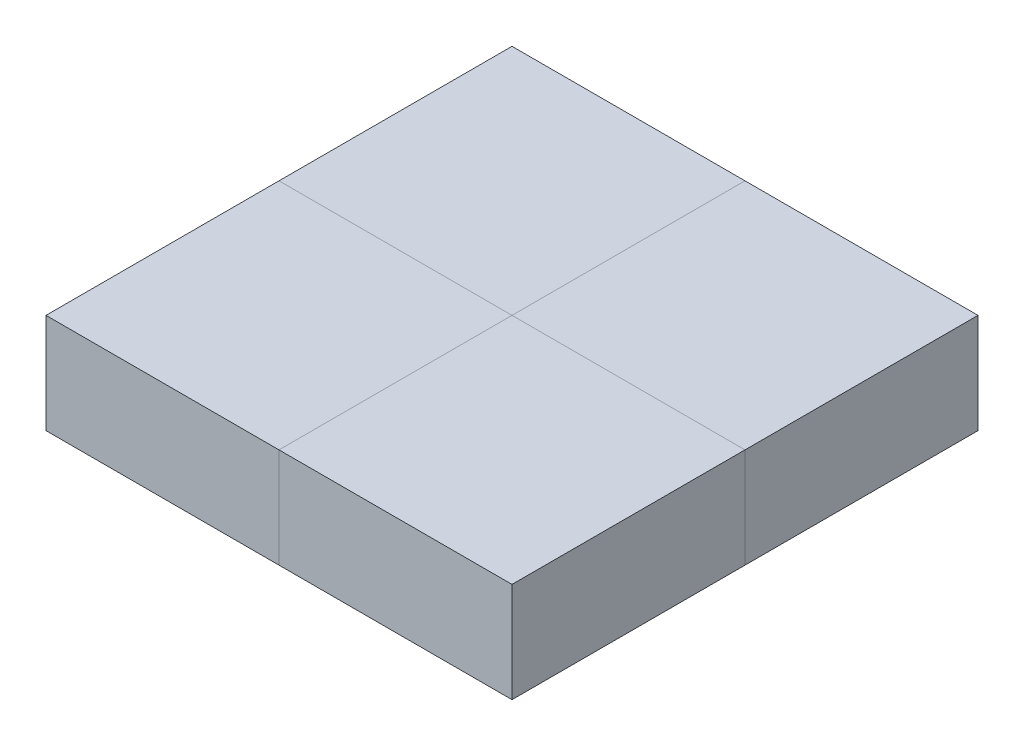
ISO-10303-21;
HEADER;
FILE_DESCRIPTION(('STEP AP214'),'2;1');
FILE_NAME('part.step','',(''),(''),'','','');
FILE_SCHEMA(('AUTOMOTIVE_DESIGN { 1 0 10303 214 1 1 1 1 }'));
ENDSEC;
DATA;
#1=APPLICATION_CONTEXT('core data for automotive mechanical design processes');
#2=APPLICATION_PROTOCOL_DEFINITION('international standard','automotive_design',2000,#1);
#3=PRODUCT_CONTEXT('',#1,'mechanical');
#4=PRODUCT('Part','Part','',(#3));
#5=PRODUCT_RELATED_PRODUCT_CATEGORY('part','',(#4));
#6=PRODUCT_DEFINITION_FORMATION('','',#4);
#7=PRODUCT_DEFINITION_CONTEXT('part definition',#1,'design');
#8=PRODUCT_DEFINITION('design','',#6,#7);
#9=PRODUCT_DEFINITION_SHAPE('','',#8);
#10=(LENGTH_UNIT() NAMED_UNIT(*) SI_UNIT(.MILLI.,.METRE.));
#11=(NAMED_UNIT(*) PLANE_ANGLE_UNIT() SI_UNIT($,.RADIAN.));
#12=(NAMED_UNIT(*) SI_UNIT($,.STERADIAN.) SOLID_ANGLE_UNIT());
#13=UNCERTAINTY_MEASURE_WITH_UNIT(LENGTH_MEASURE(1.E-05),#10,'distance_accuracy_value','');
#14=(GEOMETRIC_REPRESENTATION_CONTEXT(3) GLOBAL_UNCERTAINTY_ASSIGNED_CONTEXT((#13)) GLOBAL_UNIT_ASSIGNED_CONTEXT((#10,
#11,#12)) REPRESENTATION_CONTEXT('',''));
#15=CARTESIAN_POINT('',(0.,0.,0.));
#16=DIRECTION('',(0.,0.,1.));
#17=DIRECTION('',(1.,0.,0.));
#18=AXIS2_PLACEMENT_3D('',#15,#16,#17);
#19=CARTESIAN_POINT('',(22.225,19.05,22.225));
#20=DIRECTION('',(1.,0.,0.));
#21=DIRECTION('',(0.,0.,-1.));
#22=AXIS2_PLACEMENT_3D('',#19,#20,#21);
#23=PLANE('',#22);
#24=DIRECTION('',(0.,0.,1.));
#25=VECTOR('',#24,1.);
#26=CARTESIAN_POINT('',(22.225,0.,22.225));
#27=LINE('',#26,#25);
#28=CARTESIAN_POINT('',(22.225,0.,22.225));
#29=VERTEX_POINT('',#28);
#30=CARTESIAN_POINT('',(22.225,0.,66.675));
#31=VERTEX_POINT('',#30);
#32=EDGE_CURVE('E115',#29,#31,#27,.T.);
#33=ORIENTED_EDGE('',*,*,#32,.T.);
#34=DIRECTION('',(0.,-1.,0.));
#35=VECTOR('',#34,1.);
#36=CARTESIAN_POINT('',(22.225,19.05,66.675));
#37=LINE('',#36,#35);
#38=CARTESIAN_POINT('',(22.225,19.05,66.675));
#39=VERTEX_POINT('',#38);
#40=EDGE_CURVE('E12',#39,#31,#37,.T.);
#41=ORIENTED_EDGE('',*,*,#40,.F.);
#42=DIRECTION('',(0.,0.,1.));
#43=VECTOR('',#42,1.);
#44=CARTESIAN_POINT('',(22.225,19.05,22.225));
#45=LINE('',#44,#43);
#46=CARTESIAN_POINT('',(22.225,19.05,22.225));
#47=VERTEX_POINT('',#46);
#48=EDGE_CURVE('E97',#47,#39,#45,.T.);
#49=ORIENTED_EDGE('',*,*,#48,.F.);
#50=DIRECTION('',(0.,-1.,0.));
#51=VECTOR('',#50,1.);
#52=CARTESIAN_POINT('',(22.225,19.05,22.225));
#53=LINE('',#52,#51);
#54=EDGE_CURVE('E111',#47,#29,#53,.T.);
#55=ORIENTED_EDGE('',*,*,#54,.T.);
#56=EDGE_LOOP('',(#33,#41,#49,#55));
#57=FACE_BOUND('',#56,.T.);
#58=ADVANCED_FACE('F45',(#57),#23,.F.);
#59=CARTESIAN_POINT('',(22.225,19.05,66.675));
#60=DIRECTION('',(0.,0.,-1.));
#61=DIRECTION('',(-1.,0.,0.));
#62=AXIS2_PLACEMENT_3D('',#59,#60,#61);
#63=PLANE('',#62);
#64=DIRECTION('',(1.,0.,0.));
#65=VECTOR('',#64,1.);
#66=CARTESIAN_POINT('',(22.225,0.,66.675));
#67=LINE('',#66,#65);
#68=CARTESIAN_POINT('',(66.675,0.,66.675));
#69=VERTEX_POINT('',#68);
#70=EDGE_CURVE('E102',#31,#69,#67,.T.);
#71=ORIENTED_EDGE('',*,*,#70,.T.);
#72=DIRECTION('',(0.,-1.,0.));
#73=VECTOR('',#72,1.);
#74=CARTESIAN_POINT('',(66.675,19.05,66.675));
#75=LINE('',#74,#73);
#76=CARTESIAN_POINT('',(66.675,19.05,66.675));
#77=VERTEX_POINT('',#76);
#78=EDGE_CURVE('E54',#77,#69,#75,.T.);
#79=ORIENTED_EDGE('',*,*,#78,.F.);
#80=DIRECTION('',(1.,0.,0.));
#81=VECTOR('',#80,1.);
#82=CARTESIAN_POINT('',(22.225,19.05,66.675));
#83=LINE('',#82,#81);
#84=EDGE_CURVE('E92',#39,#77,#83,.T.);
#85=ORIENTED_EDGE('',*,*,#84,.F.);
#86=ORIENTED_EDGE('',*,*,#40,.T.);
#87=EDGE_LOOP('',(#71,#79,#85,#86));
#88=FACE_BOUND('',#87,.T.);
#89=ADVANCED_FACE('F101',(#88),#63,.F.);
#90=CARTESIAN_POINT('',(66.675,19.05,22.225));
#91=DIRECTION('',(-1.,0.,0.));
#92=DIRECTION('',(0.,0.,1.));
#93=AXIS2_PLACEMENT_3D('',#90,#91,#92);
#94=PLANE('',#93);
#95=DIRECTION('',(0.,0.,-1.));
#96=VECTOR('',#95,1.);
#97=CARTESIAN_POINT('',(66.675,0.,22.225));
#98=LINE('',#97,#96);
#99=CARTESIAN_POINT('',(66.675,0.,22.225));
#100=VERTEX_POINT('',#99);
#101=EDGE_CURVE('E79',#69,#100,#98,.T.);
#102=ORIENTED_EDGE('',*,*,#101,.T.);
#103=DIRECTION('',(0.,-1.,0.));
#104=VECTOR('',#103,1.);
#105=CARTESIAN_POINT('',(66.675,19.05,22.225));
#106=LINE('',#105,#104);
#107=CARTESIAN_POINT('',(66.675,19.05,22.225));
#108=VERTEX_POINT('',#107);
#109=EDGE_CURVE('E104',#108,#100,#106,.T.);
#110=ORIENTED_EDGE('',*,*,#109,.F.);
#111=DIRECTION('',(0.,0.,-1.));
#112=VECTOR('',#111,1.);
#113=CARTESIAN_POINT('',(66.675,19.05,22.225));
#114=LINE('',#113,#112);
#115=EDGE_CURVE('E95',#77,#108,#114,.T.);
#116=ORIENTED_EDGE('',*,*,#115,.F.);
#117=ORIENTED_EDGE('',*,*,#78,.T.);
#118=EDGE_LOOP('',(#102,#110,#116,#117));
#119=FACE_BOUND('',#118,.T.);
#120=ADVANCED_FACE('F105',(#119),#94,.F.);
#121=CARTESIAN_POINT('',(22.225,19.05,22.225));
#122=DIRECTION('',(0.,0.,1.));
#123=DIRECTION('',(1.,0.,0.));
#124=AXIS2_PLACEMENT_3D('',#121,#122,#123);
#125=PLANE('',#124);
#126=DIRECTION('',(-1.,0.,0.));
#127=VECTOR('',#126,1.);
#128=CARTESIAN_POINT('',(22.225,0.,22.225));
#129=LINE('',#128,#127);
#130=EDGE_CURVE('E85',#100,#29,#129,.T.);
#131=ORIENTED_EDGE('',*,*,#130,.T.);
#132=ORIENTED_EDGE('',*,*,#54,.F.);
#133=DIRECTION('',(-1.,0.,0.));
#134=VECTOR('',#133,1.);
#135=CARTESIAN_POINT('',(22.225,19.05,22.225));
#136=LINE('',#135,#134);
#137=EDGE_CURVE('E62',#108,#47,#136,.T.);
#138=ORIENTED_EDGE('',*,*,#137,.F.);
#139=ORIENTED_EDGE('',*,*,#109,.T.);
#140=EDGE_LOOP('',(#131,#132,#138,#139));
#141=FACE_BOUND('',#140,.T.);
#142=ADVANCED_FACE('F130',(#141),#125,.F.);
#143=CARTESIAN_POINT('',(0.,19.05,0.));
#144=DIRECTION('',(0.,1.,0.));
#145=DIRECTION('',(0.,0.,1.));
#146=AXIS2_PLACEMENT_3D('',#143,#144,#145);
#147=PLANE('',#146);
#148=ORIENTED_EDGE('',*,*,#48,.T.);
#149=ORIENTED_EDGE('',*,*,#84,.T.);
#150=ORIENTED_EDGE('',*,*,#115,.T.);
#151=ORIENTED_EDGE('',*,*,#137,.T.);
#152=EDGE_LOOP('',(#148,#149,#150,#151));
#153=FACE_BOUND('',#152,.T.);
#154=ADVANCED_FACE('F93',(#153),#147,.T.);
#155=CARTESIAN_POINT('',(0.,0.,0.));
#156=DIRECTION('',(0.,1.,0.));
#157=DIRECTION('',(0.,0.,1.));
#158=AXIS2_PLACEMENT_3D('',#155,#156,#157);
#159=PLANE('',#158);
#160=ORIENTED_EDGE('',*,*,#32,.F.);
#161=ORIENTED_EDGE('',*,*,#130,.F.);
#162=ORIENTED_EDGE('',*,*,#101,.F.);
#163=ORIENTED_EDGE('',*,*,#70,.F.);
#164=EDGE_LOOP('',(#160,#161,#162,#163));
#165=FACE_BOUND('',#164,.T.);
#166=ADVANCED_FACE('F133',(#165),#159,.F.);
#167=CLOSED_SHELL('',(#58,#89,#120,#142,#154,#166));
#168=MANIFOLD_SOLID_BREP('B2',#167);
#169=CARTESIAN_POINT('',(-22.225,19.05,22.225));
#170=DIRECTION('',(1.,0.,0.));
#171=DIRECTION('',(0.,0.,-1.));
#172=AXIS2_PLACEMENT_3D('',#169,#170,#171);
#173=PLANE('',#172);
#174=DIRECTION('',(0.,0.,1.));
#175=VECTOR('',#174,1.);
#176=CARTESIAN_POINT('',(-22.225,0.,22.225));
#177=LINE('',#176,#175);
#178=CARTESIAN_POINT('',(-22.225,0.,22.225));
#179=VERTEX_POINT('',#178);
#180=CARTESIAN_POINT('',(-22.225,0.,66.675));
#181=VERTEX_POINT('',#180);
#182=EDGE_CURVE('E283',#179,#181,#177,.T.);
#183=ORIENTED_EDGE('',*,*,#182,.T.);
#184=DIRECTION('',(0.,-1.,0.));
#185=VECTOR('',#184,1.);
#186=CARTESIAN_POINT('',(-22.225,19.05,66.675));
#187=LINE('',#186,#185);
#188=CARTESIAN_POINT('',(-22.225,19.05,66.675));
#189=VERTEX_POINT('',#188);
#190=EDGE_CURVE('E43',#189,#181,#187,.T.);
#191=ORIENTED_EDGE('',*,*,#190,.F.);
#192=DIRECTION('',(0.,0.,1.));
#193=VECTOR('',#192,1.);
#194=CARTESIAN_POINT('',(-22.225,19.05,22.225));
#195=LINE('',#194,#193);
#196=CARTESIAN_POINT('',(-22.225,19.05,22.225));
#197=VERTEX_POINT('',#196);
#198=EDGE_CURVE('E264',#197,#189,#195,.T.);
#199=ORIENTED_EDGE('',*,*,#198,.F.);
#200=DIRECTION('',(0.,-1.,0.));
#201=VECTOR('',#200,1.);
#202=CARTESIAN_POINT('',(-22.225,19.05,22.225));
#203=LINE('',#202,#201);
#204=EDGE_CURVE('E279',#197,#179,#203,.T.);
#205=ORIENTED_EDGE('',*,*,#204,.T.);
#206=EDGE_LOOP('',(#183,#191,#199,#205));
#207=FACE_BOUND('',#206,.T.);
#208=ADVANCED_FACE('F212',(#207),#173,.F.);
#209=CARTESIAN_POINT('',(-22.225,19.05,66.675));
#210=DIRECTION('',(0.,0.,-1.));
#211=DIRECTION('',(-1.,0.,0.));
#212=AXIS2_PLACEMENT_3D('',#209,#210,#211);
#213=PLANE('',#212);
#214=DIRECTION('',(1.,0.,0.));
#215=VECTOR('',#214,1.);
#216=CARTESIAN_POINT('',(-22.225,0.,66.675));
#217=LINE('',#216,#215);
#218=CARTESIAN_POINT('',(22.225,0.,66.675));
#219=VERTEX_POINT('',#218);
#220=EDGE_CURVE('E269',#181,#219,#217,.T.);
#221=ORIENTED_EDGE('',*,*,#220,.T.);
#222=DIRECTION('',(0.,-1.,0.));
#223=VECTOR('',#222,1.);
#224=CARTESIAN_POINT('',(22.225,19.05,66.675));
#225=LINE('',#224,#223);
#226=CARTESIAN_POINT('',(22.225,19.05,66.675));
#227=VERTEX_POINT('',#226);
#228=EDGE_CURVE('E221',#227,#219,#225,.T.);
#229=ORIENTED_EDGE('',*,*,#228,.F.);
#230=DIRECTION('',(1.,0.,0.));
#231=VECTOR('',#230,1.);
#232=CARTESIAN_POINT('',(-22.225,19.05,66.675));
#233=LINE('',#232,#231);
#234=EDGE_CURVE('E259',#189,#227,#233,.T.);
#235=ORIENTED_EDGE('',*,*,#234,.F.);
#236=ORIENTED_EDGE('',*,*,#190,.T.);
#237=EDGE_LOOP('',(#221,#229,#235,#236));
#238=FACE_BOUND('',#237,.T.);
#239=ADVANCED_FACE('F268',(#238),#213,.F.);
#240=CARTESIAN_POINT('',(22.225,19.05,22.225));
#241=DIRECTION('',(-1.,0.,0.));
#242=DIRECTION('',(0.,0.,1.));
#243=AXIS2_PLACEMENT_3D('',#240,#241,#242);
#244=PLANE('',#243);
#245=DIRECTION('',(0.,0.,-1.));
#246=VECTOR('',#245,1.);
#247=CARTESIAN_POINT('',(22.225,0.,22.225));
#248=LINE('',#247,#246);
#249=CARTESIAN_POINT('',(22.225,0.,22.225));
#250=VERTEX_POINT('',#249);
#251=EDGE_CURVE('E246',#219,#250,#248,.T.);
#252=ORIENTED_EDGE('',*,*,#251,.T.);
#253=DIRECTION('',(0.,-1.,0.));
#254=VECTOR('',#253,1.);
#255=CARTESIAN_POINT('',(22.225,19.05,22.225));
#256=LINE('',#255,#254);
#257=CARTESIAN_POINT('',(22.225,19.05,22.225));
#258=VERTEX_POINT('',#257);
#259=EDGE_CURVE('E271',#258,#250,#256,.T.);
#260=ORIENTED_EDGE('',*,*,#259,.F.);
#261=DIRECTION('',(0.,0.,-1.));
#262=VECTOR('',#261,1.);
#263=CARTESIAN_POINT('',(22.225,19.05,22.225));
#264=LINE('',#263,#262);
#265=EDGE_CURVE('E262',#227,#258,#264,.T.);
#266=ORIENTED_EDGE('',*,*,#265,.F.);
#267=ORIENTED_EDGE('',*,*,#228,.T.);
#268=EDGE_LOOP('',(#252,#260,#266,#267));
#269=FACE_BOUND('',#268,.T.);
#270=ADVANCED_FACE('F272',(#269),#244,.F.);
#271=CARTESIAN_POINT('',(-22.225,19.05,22.225));
#272=DIRECTION('',(0.,0.,1.));
#273=DIRECTION('',(1.,0.,0.));
#274=AXIS2_PLACEMENT_3D('',#271,#272,#273);
#275=PLANE('',#274);
#276=DIRECTION('',(-1.,0.,0.));
#277=VECTOR('',#276,1.);
#278=CARTESIAN_POINT('',(-22.225,0.,22.225));
#279=LINE('',#278,#277);
#280=EDGE_CURVE('E252',#250,#179,#279,.T.);
#281=ORIENTED_EDGE('',*,*,#280,.T.);
#282=ORIENTED_EDGE('',*,*,#204,.F.);
#283=DIRECTION('',(-1.,0.,0.));
#284=VECTOR('',#283,1.);
#285=CARTESIAN_POINT('',(-22.225,19.05,22.225));
#286=LINE('',#285,#284);
#287=EDGE_CURVE('E229',#258,#197,#286,.T.);
#288=ORIENTED_EDGE('',*,*,#287,.F.);
#289=ORIENTED_EDGE('',*,*,#259,.T.);
#290=EDGE_LOOP('',(#281,#282,#288,#289));
#291=FACE_BOUND('',#290,.T.);
#292=ADVANCED_FACE('F296',(#291),#275,.F.);
#293=CARTESIAN_POINT('',(0.,19.05,0.));
#294=DIRECTION('',(0.,1.,0.));
#295=DIRECTION('',(0.,0.,1.));
#296=AXIS2_PLACEMENT_3D('',#293,#294,#295);
#297=PLANE('',#296);
#298=ORIENTED_EDGE('',*,*,#198,.T.);
#299=ORIENTED_EDGE('',*,*,#234,.T.);
#300=ORIENTED_EDGE('',*,*,#265,.T.);
#301=ORIENTED_EDGE('',*,*,#287,.T.);
#302=EDGE_LOOP('',(#298,#299,#300,#301));
#303=FACE_BOUND('',#302,.T.);
#304=ADVANCED_FACE('F260',(#303),#297,.T.);
#305=CARTESIAN_POINT('',(0.,0.,0.));
#306=DIRECTION('',(0.,1.,0.));
#307=DIRECTION('',(0.,0.,1.));
#308=AXIS2_PLACEMENT_3D('',#305,#306,#307);
#309=PLANE('',#308);
#310=ORIENTED_EDGE('',*,*,#182,.F.);
#311=ORIENTED_EDGE('',*,*,#280,.F.);
#312=ORIENTED_EDGE('',*,*,#251,.F.);
#313=ORIENTED_EDGE('',*,*,#220,.F.);
#314=EDGE_LOOP('',(#310,#311,#312,#313));
#315=FACE_BOUND('',#314,.T.);
#316=ADVANCED_FACE('F299',(#315),#309,.F.);
#317=CLOSED_SHELL('',(#208,#239,#270,#292,#304,#316));
#318=MANIFOLD_SOLID_BREP('B6',#317);
#319=CARTESIAN_POINT('',(22.225,19.05,-22.225));
#320=DIRECTION('',(1.,0.,0.));
#321=DIRECTION('',(0.,0.,-1.));
#322=AXIS2_PLACEMENT_3D('',#319,#320,#321);
#323=PLANE('',#322);
#324=DIRECTION('',(0.,0.,1.));
#325=VECTOR('',#324,1.);
#326=CARTESIAN_POINT('',(22.225,0.,-22.225));
#327=LINE('',#326,#325);
#328=CARTESIAN_POINT('',(22.225,0.,-22.225));
#329=VERTEX_POINT('',#328);
#330=CARTESIAN_POINT('',(22.225,0.,22.225));
#331=VERTEX_POINT('',#330);
#332=EDGE_CURVE('E449',#329,#331,#327,.T.);
#333=ORIENTED_EDGE('',*,*,#332,.T.);
#334=DIRECTION('',(0.,-1.,0.));
#335=VECTOR('',#334,1.);
#336=CARTESIAN_POINT('',(22.225,19.05,22.225));
#337=LINE('',#336,#335);
#338=CARTESIAN_POINT('',(22.225,19.05,22.225));
#339=VERTEX_POINT('',#338);
#340=EDGE_CURVE('E210',#339,#331,#337,.T.);
#341=ORIENTED_EDGE('',*,*,#340,.F.);
#342=DIRECTION('',(0.,0.,1.));
#343=VECTOR('',#342,1.);
#344=CARTESIAN_POINT('',(22.225,19.05,-22.225));
#345=LINE('',#344,#343);
#346=CARTESIAN_POINT('',(22.225,19.05,-22.225));
#347=VERTEX_POINT('',#346);
#348=EDGE_CURVE('E430',#347,#339,#345,.T.);
#349=ORIENTED_EDGE('',*,*,#348,.F.);
#350=DIRECTION('',(0.,-1.,0.));
#351=VECTOR('',#350,1.);
#352=CARTESIAN_POINT('',(22.225,19.05,-22.225));
#353=LINE('',#352,#351);
#354=EDGE_CURVE('E445',#347,#329,#353,.T.);
#355=ORIENTED_EDGE('',*,*,#354,.T.);
#356=EDGE_LOOP('',(#333,#341,#349,#355));
#357=FACE_BOUND('',#356,.T.);
#358=ADVANCED_FACE('F378',(#357),#323,.F.);
#359=CARTESIAN_POINT('',(22.225,19.05,22.225));
#360=DIRECTION('',(0.,0.,-1.));
#361=DIRECTION('',(-1.,0.,0.));
#362=AXIS2_PLACEMENT_3D('',#359,#360,#361);
#363=PLANE('',#362);
#364=DIRECTION('',(1.,0.,0.));
#365=VECTOR('',#364,1.);
#366=CARTESIAN_POINT('',(22.225,0.,22.225));
#367=LINE('',#366,#365);
#368=CARTESIAN_POINT('',(66.675,0.,22.225));
#369=VERTEX_POINT('',#368);
#370=EDGE_CURVE('E435',#331,#369,#367,.T.);
#371=ORIENTED_EDGE('',*,*,#370,.T.);
#372=DIRECTION('',(0.,-1.,0.));
#373=VECTOR('',#372,1.);
#374=CARTESIAN_POINT('',(66.675,19.05,22.225));
#375=LINE('',#374,#373);
#376=CARTESIAN_POINT('',(66.675,19.05,22.225));
#377=VERTEX_POINT('',#376);
#378=EDGE_CURVE('E387',#377,#369,#375,.T.);
#379=ORIENTED_EDGE('',*,*,#378,.F.);
#380=DIRECTION('',(1.,0.,0.));
#381=VECTOR('',#380,1.);
#382=CARTESIAN_POINT('',(22.225,19.05,22.225));
#383=LINE('',#382,#381);
#384=EDGE_CURVE('E425',#339,#377,#383,.T.);
#385=ORIENTED_EDGE('',*,*,#384,.F.);
#386=ORIENTED_EDGE('',*,*,#340,.T.);
#387=EDGE_LOOP('',(#371,#379,#385,#386));
#388=FACE_BOUND('',#387,.T.);
#389=ADVANCED_FACE('F434',(#388),#363,.F.);
#390=CARTESIAN_POINT('',(66.675,19.05,-22.225));
#391=DIRECTION('',(-1.,0.,0.));
#392=DIRECTION('',(0.,0.,1.));
#393=AXIS2_PLACEMENT_3D('',#390,#391,#392);
#394=PLANE('',#393);
#395=DIRECTION('',(0.,0.,-1.));
#396=VECTOR('',#395,1.);
#397=CARTESIAN_POINT('',(66.675,0.,-22.225));
#398=LINE('',#397,#396);
#399=CARTESIAN_POINT('',(66.675,0.,-22.225));
#400=VERTEX_POINT('',#399);
#401=EDGE_CURVE('E412',#369,#400,#398,.T.);
#402=ORIENTED_EDGE('',*,*,#401,.T.);
#403=DIRECTION('',(0.,-1.,0.));
#404=VECTOR('',#403,1.);
#405=CARTESIAN_POINT('',(66.675,19.05,-22.225));
#406=LINE('',#405,#404);
#407=CARTESIAN_POINT('',(66.675,19.05,-22.225));
#408=VERTEX_POINT('',#407);
#409=EDGE_CURVE('E437',#408,#400,#406,.T.);
#410=ORIENTED_EDGE('',*,*,#409,.F.);
#411=DIRECTION('',(0.,0.,-1.));
#412=VECTOR('',#411,1.);
#413=CARTESIAN_POINT('',(66.675,19.05,-22.225));
#414=LINE('',#413,#412);
#415=EDGE_CURVE('E428',#377,#408,#414,.T.);
#416=ORIENTED_EDGE('',*,*,#415,.F.);
#417=ORIENTED_EDGE('',*,*,#378,.T.);
#418=EDGE_LOOP('',(#402,#410,#416,#417));
#419=FACE_BOUND('',#418,.T.);
#420=ADVANCED_FACE('F438',(#419),#394,.F.);
#421=CARTESIAN_POINT('',(22.225,19.05,-22.225));
#422=DIRECTION('',(0.,0.,1.));
#423=DIRECTION('',(1.,0.,0.));
#424=AXIS2_PLACEMENT_3D('',#421,#422,#423);
#425=PLANE('',#424);
#426=DIRECTION('',(-1.,0.,0.));
#427=VECTOR('',#426,1.);
#428=CARTESIAN_POINT('',(22.225,0.,-22.225));
#429=LINE('',#428,#427);
#430=EDGE_CURVE('E418',#400,#329,#429,.T.);
#431=ORIENTED_EDGE('',*,*,#430,.T.);
#432=ORIENTED_EDGE('',*,*,#354,.F.);
#433=DIRECTION('',(-1.,0.,0.));
#434=VECTOR('',#433,1.);
#435=CARTESIAN_POINT('',(22.225,19.05,-22.225));
#436=LINE('',#435,#434);
#437=EDGE_CURVE('E395',#408,#347,#436,.T.);
#438=ORIENTED_EDGE('',*,*,#437,.F.);
#439=ORIENTED_EDGE('',*,*,#409,.T.);
#440=EDGE_LOOP('',(#431,#432,#438,#439));
#441=FACE_BOUND('',#440,.T.);
#442=ADVANCED_FACE('F463',(#441),#425,.F.);
#443=CARTESIAN_POINT('',(0.,19.05,0.));
#444=DIRECTION('',(0.,1.,0.));
#445=DIRECTION('',(0.,0.,1.));
#446=AXIS2_PLACEMENT_3D('',#443,#444,#445);
#447=PLANE('',#446);
#448=ORIENTED_EDGE('',*,*,#348,.T.);
#449=ORIENTED_EDGE('',*,*,#384,.T.);
#450=ORIENTED_EDGE('',*,*,#415,.T.);
#451=ORIENTED_EDGE('',*,*,#437,.T.);
#452=EDGE_LOOP('',(#448,#449,#450,#451));
#453=FACE_BOUND('',#452,.T.);
#454=ADVANCED_FACE('F426',(#453),#447,.T.);
#455=CARTESIAN_POINT('',(0.,0.,0.));
#456=DIRECTION('',(0.,1.,0.));
#457=DIRECTION('',(0.,0.,1.));
#458=AXIS2_PLACEMENT_3D('',#455,#456,#457);
#459=PLANE('',#458);
#460=ORIENTED_EDGE('',*,*,#332,.F.);
#461=ORIENTED_EDGE('',*,*,#430,.F.);
#462=ORIENTED_EDGE('',*,*,#401,.F.);
#463=ORIENTED_EDGE('',*,*,#370,.F.);
#464=EDGE_LOOP('',(#460,#461,#462,#463));
#465=FACE_BOUND('',#464,.T.);
#466=ADVANCED_FACE('F466',(#465),#459,.F.);
#467=CLOSED_SHELL('',(#358,#389,#420,#442,#454,#466));
#468=MANIFOLD_SOLID_BREP('B37',#467);
#469=CARTESIAN_POINT('',(22.225,19.05,-22.225));
#470=DIRECTION('',(-1.,0.,0.));
#471=DIRECTION('',(0.,0.,1.));
#472=AXIS2_PLACEMENT_3D('',#469,#470,#471);
#473=PLANE('',#472);
#474=DIRECTION('',(0.,0.,-1.));
#475=VECTOR('',#474,1.);
#476=CARTESIAN_POINT('',(22.225,0.,-22.225));
#477=LINE('',#476,#475);
#478=CARTESIAN_POINT('',(22.225,0.,22.225));
#479=VERTEX_POINT('',#478);
#480=CARTESIAN_POINT('',(22.225,0.,-22.225));
#481=VERTEX_POINT('',#480);
#482=EDGE_CURVE('E602',#479,#481,#477,.T.);
#483=ORIENTED_EDGE('',*,*,#482,.T.);
#484=DIRECTION('',(0.,-1.,0.));
#485=VECTOR('',#484,1.);
#486=CARTESIAN_POINT('',(22.225,19.05,-22.225));
#487=LINE('',#486,#485);
#488=CARTESIAN_POINT('',(22.225,19.05,-22.225));
#489=VERTEX_POINT('',#488);
#490=EDGE_CURVE('E376',#489,#481,#487,.T.);
#491=ORIENTED_EDGE('',*,*,#490,.F.);
#492=DIRECTION('',(0.,0.,-1.));
#493=VECTOR('',#492,1.);
#494=CARTESIAN_POINT('',(22.225,19.05,-22.225));
#495=LINE('',#494,#493);
#496=CARTESIAN_POINT('',(22.225,19.05,22.225));
#497=VERTEX_POINT('',#496);
#498=EDGE_CURVE('E585',#497,#489,#495,.T.);
#499=ORIENTED_EDGE('',*,*,#498,.F.);
#500=DIRECTION('',(0.,-1.,0.));
#501=VECTOR('',#500,1.);
#502=CARTESIAN_POINT('',(22.225,19.05,22.225));
#503=LINE('',#502,#501);
#504=EDGE_CURVE('E598',#497,#479,#503,.T.);
#505=ORIENTED_EDGE('',*,*,#504,.T.);
#506=EDGE_LOOP('',(#483,#491,#499,#505));
#507=FACE_BOUND('',#506,.T.);
#508=ADVANCED_FACE('F533',(#507),#473,.F.);
#509=CARTESIAN_POINT('',(-22.225,19.05,-22.225));
#510=DIRECTION('',(0.,0.,1.));
#511=DIRECTION('',(1.,0.,0.));
#512=AXIS2_PLACEMENT_3D('',#509,#510,#511);
#513=PLANE('',#512);
#514=DIRECTION('',(-1.,0.,0.));
#515=VECTOR('',#514,1.);
#516=CARTESIAN_POINT('',(-22.225,0.,-22.225));
#517=LINE('',#516,#515);
#518=CARTESIAN_POINT('',(-22.225,0.,-22.225));
#519=VERTEX_POINT('',#518);
#520=EDGE_CURVE('E590',#481,#519,#517,.T.);
#521=ORIENTED_EDGE('',*,*,#520,.T.);
#522=DIRECTION('',(0.,-1.,0.));
#523=VECTOR('',#522,1.);
#524=CARTESIAN_POINT('',(-22.225,19.05,-22.225));
#525=LINE('',#524,#523);
#526=CARTESIAN_POINT('',(-22.225,19.05,-22.225));
#527=VERTEX_POINT('',#526);
#528=EDGE_CURVE('E542',#527,#519,#525,.T.);
#529=ORIENTED_EDGE('',*,*,#528,.F.);
#530=DIRECTION('',(-1.,0.,0.));
#531=VECTOR('',#530,1.);
#532=CARTESIAN_POINT('',(-22.225,19.05,-22.225));
#533=LINE('',#532,#531);
#534=EDGE_CURVE('E580',#489,#527,#533,.T.);
#535=ORIENTED_EDGE('',*,*,#534,.F.);
#536=ORIENTED_EDGE('',*,*,#490,.T.);
#537=EDGE_LOOP('',(#521,#529,#535,#536));
#538=FACE_BOUND('',#537,.T.);
#539=ADVANCED_FACE('F589',(#538),#513,.F.);
#540=CARTESIAN_POINT('',(-22.225,19.05,-22.225));
#541=DIRECTION('',(1.,0.,0.));
#542=DIRECTION('',(0.,0.,-1.));
#543=AXIS2_PLACEMENT_3D('',#540,#541,#542);
#544=PLANE('',#543);
#545=DIRECTION('',(0.,0.,1.));
#546=VECTOR('',#545,1.);
#547=CARTESIAN_POINT('',(-22.225,0.,-22.225));
#548=LINE('',#547,#546);
#549=CARTESIAN_POINT('',(-22.225,0.,22.225));
#550=VERTEX_POINT('',#549);
#551=EDGE_CURVE('E567',#519,#550,#548,.T.);
#552=ORIENTED_EDGE('',*,*,#551,.T.);
#553=DIRECTION('',(0.,-1.,0.));
#554=VECTOR('',#553,1.);
#555=CARTESIAN_POINT('',(-22.225,19.05,22.225));
#556=LINE('',#555,#554);
#557=CARTESIAN_POINT('',(-22.225,19.05,22.225));
#558=VERTEX_POINT('',#557);
#559=EDGE_CURVE('E592',#558,#550,#556,.T.);
#560=ORIENTED_EDGE('',*,*,#559,.F.);
#561=DIRECTION('',(0.,0.,1.));
#562=VECTOR('',#561,1.);
#563=CARTESIAN_POINT('',(-22.225,19.05,-22.225));
#564=LINE('',#563,#562);
#565=EDGE_CURVE('E583',#527,#558,#564,.T.);
#566=ORIENTED_EDGE('',*,*,#565,.F.);
#567=ORIENTED_EDGE('',*,*,#528,.T.);
#568=EDGE_LOOP('',(#552,#560,#566,#567));
#569=FACE_BOUND('',#568,.T.);
#570=ADVANCED_FACE('F593',(#569),#544,.F.);
#571=CARTESIAN_POINT('',(-22.225,19.05,22.225));
#572=DIRECTION('',(0.,0.,-1.));
#573=DIRECTION('',(-1.,0.,0.));
#574=AXIS2_PLACEMENT_3D('',#571,#572,#573);
#575=PLANE('',#574);
#576=DIRECTION('',(1.,0.,0.));
#577=VECTOR('',#576,1.);
#578=CARTESIAN_POINT('',(-22.225,0.,22.225));
#579=LINE('',#578,#577);
#580=EDGE_CURVE('E573',#550,#479,#579,.T.);
#581=ORIENTED_EDGE('',*,*,#580,.T.);
#582=ORIENTED_EDGE('',*,*,#504,.F.);
#583=DIRECTION('',(1.,0.,0.));
#584=VECTOR('',#583,1.);
#585=CARTESIAN_POINT('',(-22.225,19.05,22.225));
#586=LINE('',#585,#584);
#587=EDGE_CURVE('E550',#558,#497,#586,.T.);
#588=ORIENTED_EDGE('',*,*,#587,.F.);
#589=ORIENTED_EDGE('',*,*,#559,.T.);
#590=EDGE_LOOP('',(#581,#582,#588,#589));
#591=FACE_BOUND('',#590,.T.);
#592=ADVANCED_FACE('F617',(#591),#575,.F.);
#593=CARTESIAN_POINT('',(0.,19.05,0.));
#594=DIRECTION('',(0.,1.,0.));
#595=DIRECTION('',(0.,0.,1.));
#596=AXIS2_PLACEMENT_3D('',#593,#594,#595);
#597=PLANE('',#596);
#598=ORIENTED_EDGE('',*,*,#498,.T.);
#599=ORIENTED_EDGE('',*,*,#534,.T.);
#600=ORIENTED_EDGE('',*,*,#565,.T.);
#601=ORIENTED_EDGE('',*,*,#587,.T.);
#602=EDGE_LOOP('',(#598,#599,#600,#601));
#603=FACE_BOUND('',#602,.T.);
#604=ADVANCED_FACE('F581',(#603),#597,.T.);
#605=CARTESIAN_POINT('',(0.,0.,0.));
#606=DIRECTION('',(0.,1.,0.));
#607=DIRECTION('',(0.,0.,1.));
#608=AXIS2_PLACEMENT_3D('',#605,#606,#607);
#609=PLANE('',#608);
#610=ORIENTED_EDGE('',*,*,#482,.F.);
#611=ORIENTED_EDGE('',*,*,#580,.F.);
#612=ORIENTED_EDGE('',*,*,#551,.F.);
#613=ORIENTED_EDGE('',*,*,#520,.F.);
#614=EDGE_LOOP('',(#610,#611,#612,#613));
#615=FACE_BOUND('',#614,.T.);
#616=ADVANCED_FACE('F620',(#615),#609,.F.);
#617=CLOSED_SHELL('',(#508,#539,#570,#592,#604,#616));
#618=MANIFOLD_SOLID_BREP('B204',#617);
#619=ADVANCED_BREP_SHAPE_REPRESENTATION('',(#18,#168,#318,#468,#618),#14);
#620=SHAPE_DEFINITION_REPRESENTATION(#9,#619);
ENDSEC;
END-ISO-10303-21;
